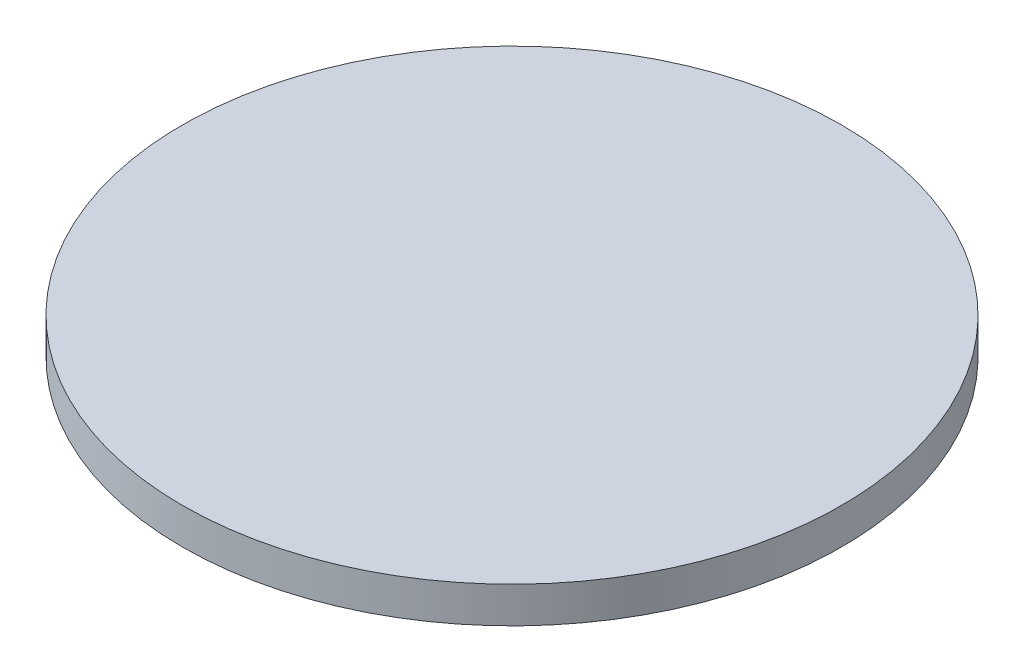
ISO-10303-21;
HEADER;
FILE_DESCRIPTION(('STEP AP214'),'2;1');
FILE_NAME('part.step','',(''),(''),'','','');
FILE_SCHEMA(('AUTOMOTIVE_DESIGN { 1 0 10303 214 1 1 1 1 }'));
ENDSEC;
DATA;
#1=APPLICATION_CONTEXT('core data for automotive mechanical design processes');
#2=APPLICATION_PROTOCOL_DEFINITION('international standard','automotive_design',2000,#1);
#3=PRODUCT_CONTEXT('',#1,'mechanical');
#4=PRODUCT('Part','Part','',(#3));
#5=PRODUCT_RELATED_PRODUCT_CATEGORY('part','',(#4));
#6=PRODUCT_DEFINITION_FORMATION('','',#4);
#7=PRODUCT_DEFINITION_CONTEXT('part definition',#1,'design');
#8=PRODUCT_DEFINITION('design','',#6,#7);
#9=PRODUCT_DEFINITION_SHAPE('','',#8);
#10=(LENGTH_UNIT() NAMED_UNIT(*) SI_UNIT(.MILLI.,.METRE.));
#11=(NAMED_UNIT(*) PLANE_ANGLE_UNIT() SI_UNIT($,.RADIAN.));
#12=(NAMED_UNIT(*) SI_UNIT($,.STERADIAN.) SOLID_ANGLE_UNIT());
#13=UNCERTAINTY_MEASURE_WITH_UNIT(LENGTH_MEASURE(1.E-05),#10,'distance_accuracy_value','');
#14=(GEOMETRIC_REPRESENTATION_CONTEXT(3) GLOBAL_UNCERTAINTY_ASSIGNED_CONTEXT((#13)) GLOBAL_UNIT_ASSIGNED_CONTEXT((#10,
#11,#12)) REPRESENTATION_CONTEXT('',''));
#15=CARTESIAN_POINT('',(0.,0.,0.));
#16=DIRECTION('',(0.,0.,1.));
#17=DIRECTION('',(1.,0.,0.));
#18=AXIS2_PLACEMENT_3D('',#15,#16,#17);
#19=CARTESIAN_POINT('',(0.,28.,0.));
#20=DIRECTION('',(0.,1.,0.));
#21=DIRECTION('',(0.,0.,1.));
#22=AXIS2_PLACEMENT_3D('',#19,#20,#21);
#23=CYLINDRICAL_SURFACE('',#22,137.);
#24=CARTESIAN_POINT('',(0.,28.,0.));
#25=DIRECTION('',(0.,1.,0.));
#26=DIRECTION('',(0.,0.,1.));
#27=AXIS2_PLACEMENT_3D('',#24,#25,#26);
#28=CIRCLE('',#27,137.);
#29=CARTESIAN_POINT('',(0.,28.,137.));
#30=VERTEX_POINT('',#29);
#31=EDGE_CURVE('E34',#30,#30,#28,.T.);
#32=ORIENTED_EDGE('',*,*,#31,.T.);
#33=EDGE_LOOP('',(#32));
#34=FACE_BOUND('',#33,.T.);
#35=CARTESIAN_POINT('',(0.,43.,0.));
#36=DIRECTION('',(0.,1.,0.));
#37=DIRECTION('',(0.,0.,1.));
#38=AXIS2_PLACEMENT_3D('',#35,#36,#37);
#39=CIRCLE('',#38,137.);
#40=CARTESIAN_POINT('',(0.,43.,137.));
#41=VERTEX_POINT('',#40);
#42=EDGE_CURVE('E49',#41,#41,#39,.T.);
#43=ORIENTED_EDGE('',*,*,#42,.F.);
#44=EDGE_LOOP('',(#43));
#45=FACE_BOUND('',#44,.T.);
#46=ADVANCED_FACE('F31',(#34,#45),#23,.T.);
#47=CARTESIAN_POINT('',(137.,28.,0.));
#48=DIRECTION('',(0.,-1.,0.));
#49=DIRECTION('',(0.,0.,-1.));
#50=AXIS2_PLACEMENT_3D('',#47,#48,#49);
#51=PLANE('',#50);
#52=CARTESIAN_POINT('',(0.,28.,0.));
#53=DIRECTION('',(0.,-1.,0.));
#54=DIRECTION('',(0.,0.,-1.));
#55=AXIS2_PLACEMENT_3D('',#52,#53,#54);
#56=CIRCLE('',#55,114.5);
#57=CARTESIAN_POINT('',(0.,28.,-114.5));
#58=VERTEX_POINT('',#57);
#59=EDGE_CURVE('E38',#58,#58,#56,.T.);
#60=ORIENTED_EDGE('',*,*,#59,.F.);
#61=EDGE_LOOP('',(#60));
#62=FACE_BOUND('',#61,.T.);
#63=ORIENTED_EDGE('',*,*,#31,.F.);
#64=EDGE_LOOP('',(#63));
#65=FACE_BOUND('',#64,.T.);
#66=ADVANCED_FACE('F58',(#62,#65),#51,.T.);
#67=CARTESIAN_POINT('',(0.,43.,0.));
#68=DIRECTION('',(0.,1.,0.));
#69=DIRECTION('',(0.,0.,1.));
#70=AXIS2_PLACEMENT_3D('',#67,#68,#69);
#71=PLANE('',#70);
#72=ORIENTED_EDGE('',*,*,#42,.T.);
#73=EDGE_LOOP('',(#72));
#74=FACE_BOUND('',#73,.T.);
#75=ADVANCED_FACE('F60',(#74),#71,.T.);
#76=CARTESIAN_POINT('',(0.,20.,0.));
#77=DIRECTION('',(0.,1.,0.));
#78=DIRECTION('',(0.,0.,1.));
#79=AXIS2_PLACEMENT_3D('',#76,#77,#78);
#80=CYLINDRICAL_SURFACE('',#79,114.5);
#81=CARTESIAN_POINT('',(0.,20.,0.));
#82=DIRECTION('',(0.,-1.,0.));
#83=DIRECTION('',(0.,0.,-1.));
#84=AXIS2_PLACEMENT_3D('',#81,#82,#83);
#85=CIRCLE('',#84,114.5);
#86=CARTESIAN_POINT('',(0.,20.,-114.5));
#87=VERTEX_POINT('',#86);
#88=EDGE_CURVE('E47',#87,#87,#85,.T.);
#89=ORIENTED_EDGE('',*,*,#88,.F.);
#90=EDGE_LOOP('',(#89));
#91=FACE_BOUND('',#90,.T.);
#92=ORIENTED_EDGE('',*,*,#59,.T.);
#93=EDGE_LOOP('',(#92));
#94=FACE_BOUND('',#93,.T.);
#95=ADVANCED_FACE('F66',(#91,#94),#80,.T.);
#96=CARTESIAN_POINT('',(0.,20.,0.));
#97=DIRECTION('',(0.,-1.,0.));
#98=DIRECTION('',(0.,0.,-1.));
#99=AXIS2_PLACEMENT_3D('',#96,#97,#98);
#100=PLANE('',#99);
#101=CARTESIAN_POINT('',(0.,20.,0.));
#102=DIRECTION('',(0.,-1.,0.));
#103=DIRECTION('',(0.,0.,-1.));
#104=AXIS2_PLACEMENT_3D('',#101,#102,#103);
#105=CIRCLE('',#104,82.5);
#106=CARTESIAN_POINT('',(0.,20.,-82.5));
#107=VERTEX_POINT('',#106);
#108=EDGE_CURVE('E10',#107,#107,#105,.T.);
#109=ORIENTED_EDGE('',*,*,#108,.F.);
#110=EDGE_LOOP('',(#109));
#111=FACE_BOUND('',#110,.T.);
#112=ORIENTED_EDGE('',*,*,#88,.T.);
#113=EDGE_LOOP('',(#112));
#114=FACE_BOUND('',#113,.T.);
#115=ADVANCED_FACE('F72',(#111,#114),#100,.T.);
#116=CARTESIAN_POINT('',(0.,12.,0.));
#117=DIRECTION('',(0.,1.,0.));
#118=DIRECTION('',(0.,0.,1.));
#119=AXIS2_PLACEMENT_3D('',#116,#117,#118);
#120=CYLINDRICAL_SURFACE('',#119,82.5);
#121=CARTESIAN_POINT('',(0.,12.,0.));
#122=DIRECTION('',(0.,-1.,0.));
#123=DIRECTION('',(0.,0.,-1.));
#124=AXIS2_PLACEMENT_3D('',#121,#122,#123);
#125=CIRCLE('',#124,82.5);
#126=CARTESIAN_POINT('',(0.,12.,-82.5));
#127=VERTEX_POINT('',#126);
#128=EDGE_CURVE('E46',#127,#127,#125,.T.);
#129=ORIENTED_EDGE('',*,*,#128,.F.);
#130=EDGE_LOOP('',(#129));
#131=FACE_BOUND('',#130,.T.);
#132=ORIENTED_EDGE('',*,*,#108,.T.);
#133=EDGE_LOOP('',(#132));
#134=FACE_BOUND('',#133,.T.);
#135=ADVANCED_FACE('F76',(#131,#134),#120,.T.);
#136=CARTESIAN_POINT('',(0.,12.,0.));
#137=DIRECTION('',(0.,-1.,0.));
#138=DIRECTION('',(0.,0.,-1.));
#139=AXIS2_PLACEMENT_3D('',#136,#137,#138);
#140=PLANE('',#139);
#141=ORIENTED_EDGE('',*,*,#128,.T.);
#142=EDGE_LOOP('',(#141));
#143=FACE_BOUND('',#142,.T.);
#144=ADVANCED_FACE('F80',(#143),#140,.T.);
#145=CLOSED_SHELL('',(#46,#66,#75,#95,#115,#135,#144));
#146=MANIFOLD_SOLID_BREP('B2',#145);
#147=ADVANCED_BREP_SHAPE_REPRESENTATION('',(#18,#146),#14);
#148=SHAPE_DEFINITION_REPRESENTATION(#9,#147);
ENDSEC;
END-ISO-10303-21;
